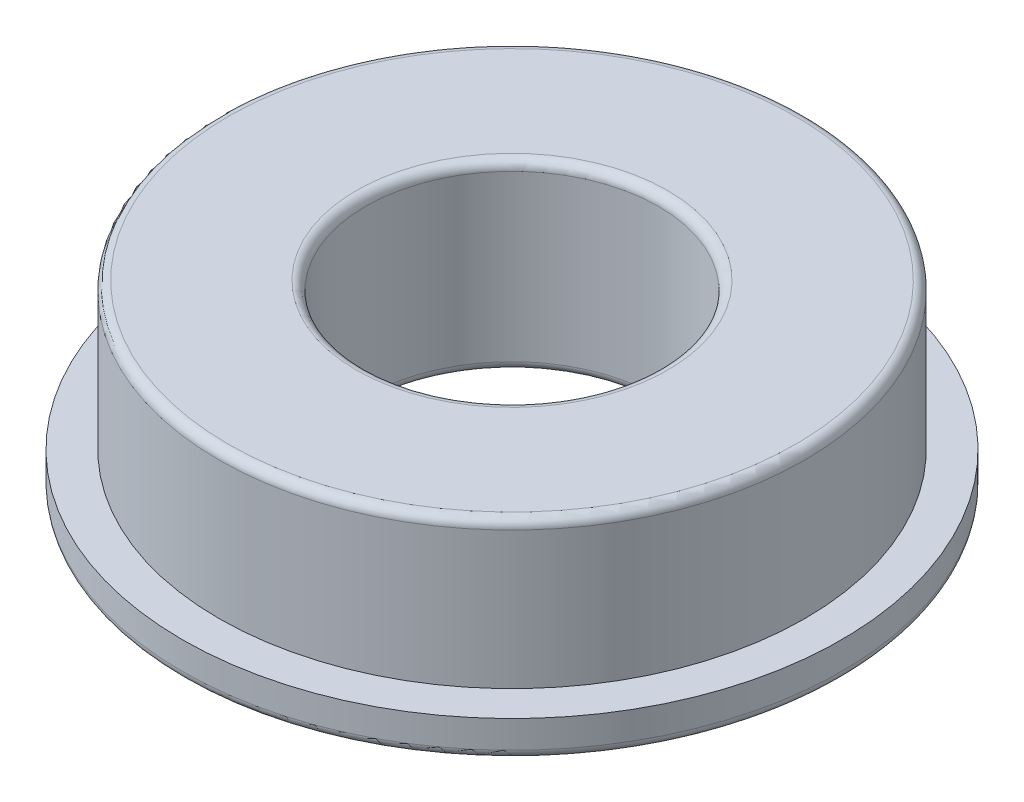
ISO-10303-21;
HEADER;
FILE_DESCRIPTION(('STEP AP214'),'2;1');
FILE_NAME('part.step','',(''),(''),'','','');
FILE_SCHEMA(('AUTOMOTIVE_DESIGN { 1 0 10303 214 1 1 1 1 }'));
ENDSEC;
DATA;
#1=APPLICATION_CONTEXT('core data for automotive mechanical design processes');
#2=APPLICATION_PROTOCOL_DEFINITION('international standard','automotive_design',2000,#1);
#3=PRODUCT_CONTEXT('',#1,'mechanical');
#4=PRODUCT('Part','Part','',(#3));
#5=PRODUCT_RELATED_PRODUCT_CATEGORY('part','',(#4));
#6=PRODUCT_DEFINITION_FORMATION('','',#4);
#7=PRODUCT_DEFINITION_CONTEXT('part definition',#1,'design');
#8=PRODUCT_DEFINITION('design','',#6,#7);
#9=PRODUCT_DEFINITION_SHAPE('','',#8);
#10=(LENGTH_UNIT() NAMED_UNIT(*) SI_UNIT(.MILLI.,.METRE.));
#11=(NAMED_UNIT(*) PLANE_ANGLE_UNIT() SI_UNIT($,.RADIAN.));
#12=(NAMED_UNIT(*) SI_UNIT($,.STERADIAN.) SOLID_ANGLE_UNIT());
#13=UNCERTAINTY_MEASURE_WITH_UNIT(LENGTH_MEASURE(1.E-05),#10,'distance_accuracy_value','');
#14=(GEOMETRIC_REPRESENTATION_CONTEXT(3) GLOBAL_UNCERTAINTY_ASSIGNED_CONTEXT((#13)) GLOBAL_UNIT_ASSIGNED_CONTEXT((#10,
#11,#12)) REPRESENTATION_CONTEXT('',''));
#15=CARTESIAN_POINT('',(0.,0.,0.));
#16=DIRECTION('',(0.,0.,1.));
#17=DIRECTION('',(1.,0.,0.));
#18=AXIS2_PLACEMENT_3D('',#15,#16,#17);
#19=CARTESIAN_POINT('',(8.,5.,0.));
#20=DIRECTION('',(0.,1.,0.));
#21=DIRECTION('',(0.,0.,1.));
#22=AXIS2_PLACEMENT_3D('',#19,#20,#21);
#23=PLANE('',#22);
#24=CARTESIAN_POINT('',(0.,5.,0.));
#25=DIRECTION('',(0.,1.,0.));
#26=DIRECTION('',(0.,0.,1.));
#27=AXIS2_PLACEMENT_3D('',#24,#25,#26);
#28=CIRCLE('',#27,7.75);
#29=CARTESIAN_POINT('',(0.,5.,7.75));
#30=VERTEX_POINT('',#29);
#31=EDGE_CURVE('E10',#30,#30,#28,.T.);
#32=ORIENTED_EDGE('',*,*,#31,.T.);
#33=EDGE_LOOP('',(#32));
#34=FACE_BOUND('',#33,.T.);
#35=CARTESIAN_POINT('',(0.,5.,0.));
#36=DIRECTION('',(0.,1.,0.));
#37=DIRECTION('',(0.,0.,1.));
#38=AXIS2_PLACEMENT_3D('',#35,#36,#37);
#39=CIRCLE('',#38,4.25);
#40=CARTESIAN_POINT('',(0.,5.,4.25));
#41=VERTEX_POINT('',#40);
#42=EDGE_CURVE('E38',#41,#41,#39,.F.);
#43=ORIENTED_EDGE('',*,*,#42,.T.);
#44=EDGE_LOOP('',(#43));
#45=FACE_BOUND('',#44,.T.);
#46=ADVANCED_FACE('F31',(#34,#45),#23,.T.);
#47=CARTESIAN_POINT('',(0.,0.,0.));
#48=DIRECTION('',(0.,-1.,0.));
#49=DIRECTION('',(0.,0.,-1.));
#50=AXIS2_PLACEMENT_3D('',#47,#48,#49);
#51=CYLINDRICAL_SURFACE('',#50,4.);
#52=CARTESIAN_POINT('',(0.,0.25,0.));
#53=DIRECTION('',(0.,-1.,0.));
#54=DIRECTION('',(0.,0.,-1.));
#55=AXIS2_PLACEMENT_3D('',#52,#53,#54);
#56=CIRCLE('',#55,4.);
#57=CARTESIAN_POINT('',(0.,0.25,-4.));
#58=VERTEX_POINT('',#57);
#59=EDGE_CURVE('E57',#58,#58,#56,.T.);
#60=ORIENTED_EDGE('',*,*,#59,.T.);
#61=EDGE_LOOP('',(#60));
#62=FACE_BOUND('',#61,.T.);
#63=CARTESIAN_POINT('',(0.,4.75,0.));
#64=DIRECTION('',(0.,1.,0.));
#65=DIRECTION('',(0.,0.,1.));
#66=AXIS2_PLACEMENT_3D('',#63,#64,#65);
#67=CIRCLE('',#66,4.);
#68=CARTESIAN_POINT('',(0.,4.75,4.));
#69=VERTEX_POINT('',#68);
#70=EDGE_CURVE('E60',#69,#69,#67,.T.);
#71=ORIENTED_EDGE('',*,*,#70,.T.);
#72=EDGE_LOOP('',(#71));
#73=FACE_BOUND('',#72,.T.);
#74=ADVANCED_FACE('F88',(#62,#73),#51,.F.);
#75=CARTESIAN_POINT('',(4.,0.,0.));
#76=DIRECTION('',(0.,-1.,0.));
#77=DIRECTION('',(0.,0.,-1.));
#78=AXIS2_PLACEMENT_3D('',#75,#76,#77);
#79=PLANE('',#78);
#80=CARTESIAN_POINT('',(0.,0.,0.));
#81=DIRECTION('',(0.,-1.,0.));
#82=DIRECTION('',(0.,0.,-1.));
#83=AXIS2_PLACEMENT_3D('',#80,#81,#82);
#84=CIRCLE('',#83,4.25);
#85=CARTESIAN_POINT('',(0.,0.,-4.25));
#86=VERTEX_POINT('',#85);
#87=EDGE_CURVE('E51',#86,#86,#84,.F.);
#88=ORIENTED_EDGE('',*,*,#87,.T.);
#89=EDGE_LOOP('',(#88));
#90=FACE_BOUND('',#89,.T.);
#91=CARTESIAN_POINT('',(0.,0.,0.));
#92=DIRECTION('',(0.,-1.,0.));
#93=DIRECTION('',(0.,0.,-1.));
#94=AXIS2_PLACEMENT_3D('',#91,#92,#93);
#95=CIRCLE('',#94,8.75);
#96=CARTESIAN_POINT('',(0.,0.,-8.75));
#97=VERTEX_POINT('',#96);
#98=EDGE_CURVE('E54',#97,#97,#95,.T.);
#99=ORIENTED_EDGE('',*,*,#98,.T.);
#100=EDGE_LOOP('',(#99));
#101=FACE_BOUND('',#100,.T.);
#102=ADVANCED_FACE('F93',(#90,#101),#79,.T.);
#103=CARTESIAN_POINT('',(0.,0.,0.));
#104=DIRECTION('',(0.,-1.,0.));
#105=DIRECTION('',(0.,0.,-1.));
#106=AXIS2_PLACEMENT_3D('',#103,#104,#105);
#107=CYLINDRICAL_SURFACE('',#106,9.);
#108=CARTESIAN_POINT('',(0.,0.25,0.));
#109=DIRECTION('',(0.,-1.,0.));
#110=DIRECTION('',(0.,0.,-1.));
#111=AXIS2_PLACEMENT_3D('',#108,#109,#110);
#112=CIRCLE('',#111,9.);
#113=CARTESIAN_POINT('',(0.,0.25,-9.));
#114=VERTEX_POINT('',#113);
#115=EDGE_CURVE('E46',#114,#114,#112,.F.);
#116=ORIENTED_EDGE('',*,*,#115,.T.);
#117=EDGE_LOOP('',(#116));
#118=FACE_BOUND('',#117,.T.);
#119=CARTESIAN_POINT('',(0.,1.,0.));
#120=DIRECTION('',(0.,-1.,0.));
#121=DIRECTION('',(0.,0.,-1.));
#122=AXIS2_PLACEMENT_3D('',#119,#120,#121);
#123=CIRCLE('',#122,9.);
#124=CARTESIAN_POINT('',(0.,1.,-9.));
#125=VERTEX_POINT('',#124);
#126=EDGE_CURVE('E63',#125,#125,#123,.T.);
#127=ORIENTED_EDGE('',*,*,#126,.T.);
#128=EDGE_LOOP('',(#127));
#129=FACE_BOUND('',#128,.T.);
#130=ADVANCED_FACE('F85',(#118,#129),#107,.T.);
#131=CARTESIAN_POINT('',(9.,1.,0.));
#132=DIRECTION('',(0.,1.,0.));
#133=DIRECTION('',(0.,0.,1.));
#134=AXIS2_PLACEMENT_3D('',#131,#132,#133);
#135=PLANE('',#134);
#136=CARTESIAN_POINT('',(0.,1.,0.));
#137=DIRECTION('',(0.,-1.,0.));
#138=DIRECTION('',(0.,0.,-1.));
#139=AXIS2_PLACEMENT_3D('',#136,#137,#138);
#140=CIRCLE('',#139,8.);
#141=CARTESIAN_POINT('',(0.,1.,-8.));
#142=VERTEX_POINT('',#141);
#143=EDGE_CURVE('E66',#142,#142,#140,.T.);
#144=ORIENTED_EDGE('',*,*,#143,.T.);
#145=EDGE_LOOP('',(#144));
#146=FACE_BOUND('',#145,.T.);
#147=ORIENTED_EDGE('',*,*,#126,.F.);
#148=EDGE_LOOP('',(#147));
#149=FACE_BOUND('',#148,.T.);
#150=ADVANCED_FACE('F70',(#146,#149),#135,.T.);
#151=CARTESIAN_POINT('',(0.,0.,0.));
#152=DIRECTION('',(0.,-1.,0.));
#153=DIRECTION('',(0.,0.,-1.));
#154=AXIS2_PLACEMENT_3D('',#151,#152,#153);
#155=CYLINDRICAL_SURFACE('',#154,8.);
#156=CARTESIAN_POINT('',(0.,4.75,0.));
#157=DIRECTION('',(0.,1.,0.));
#158=DIRECTION('',(0.,0.,1.));
#159=AXIS2_PLACEMENT_3D('',#156,#157,#158);
#160=CIRCLE('',#159,8.);
#161=CARTESIAN_POINT('',(0.,4.75,8.));
#162=VERTEX_POINT('',#161);
#163=EDGE_CURVE('E42',#162,#162,#160,.F.);
#164=ORIENTED_EDGE('',*,*,#163,.T.);
#165=EDGE_LOOP('',(#164));
#166=FACE_BOUND('',#165,.T.);
#167=ORIENTED_EDGE('',*,*,#143,.F.);
#168=EDGE_LOOP('',(#167));
#169=FACE_BOUND('',#168,.T.);
#170=ADVANCED_FACE('F73',(#166,#169),#155,.T.);
#171=CARTESIAN_POINT('',(0.,0.25,0.));
#172=DIRECTION('',(0.,-1.,0.));
#173=DIRECTION('',(0.,0.,-1.));
#174=AXIS2_PLACEMENT_3D('',#171,#172,#173);
#175=TOROIDAL_SURFACE('',#174,4.25,0.25);
#176=ORIENTED_EDGE('',*,*,#87,.F.);
#177=EDGE_LOOP('',(#176));
#178=FACE_BOUND('',#177,.T.);
#179=ORIENTED_EDGE('',*,*,#59,.F.);
#180=EDGE_LOOP('',(#179));
#181=FACE_BOUND('',#180,.T.);
#182=ADVANCED_FACE('F75',(#178,#181),#175,.T.);
#183=CARTESIAN_POINT('',(0.,0.25,0.));
#184=DIRECTION('',(0.,-1.,0.));
#185=DIRECTION('',(0.,0.,-1.));
#186=AXIS2_PLACEMENT_3D('',#183,#184,#185);
#187=TOROIDAL_SURFACE('',#186,8.75,0.25);
#188=ORIENTED_EDGE('',*,*,#115,.F.);
#189=EDGE_LOOP('',(#188));
#190=FACE_BOUND('',#189,.T.);
#191=ORIENTED_EDGE('',*,*,#98,.F.);
#192=EDGE_LOOP('',(#191));
#193=FACE_BOUND('',#192,.T.);
#194=ADVANCED_FACE('F82',(#190,#193),#187,.T.);
#195=CARTESIAN_POINT('',(0.,4.75,0.));
#196=DIRECTION('',(0.,1.,0.));
#197=DIRECTION('',(0.,0.,1.));
#198=AXIS2_PLACEMENT_3D('',#195,#196,#197);
#199=TOROIDAL_SURFACE('',#198,7.75,0.25);
#200=ORIENTED_EDGE('',*,*,#31,.F.);
#201=EDGE_LOOP('',(#200));
#202=FACE_BOUND('',#201,.T.);
#203=ORIENTED_EDGE('',*,*,#163,.F.);
#204=EDGE_LOOP('',(#203));
#205=FACE_BOUND('',#204,.T.);
#206=ADVANCED_FACE('F99',(#202,#205),#199,.T.);
#207=CARTESIAN_POINT('',(0.,4.75,0.));
#208=DIRECTION('',(0.,1.,0.));
#209=DIRECTION('',(0.,0.,1.));
#210=AXIS2_PLACEMENT_3D('',#207,#208,#209);
#211=TOROIDAL_SURFACE('',#210,4.25,0.25);
#212=ORIENTED_EDGE('',*,*,#70,.F.);
#213=EDGE_LOOP('',(#212));
#214=FACE_BOUND('',#213,.T.);
#215=ORIENTED_EDGE('',*,*,#42,.F.);
#216=EDGE_LOOP('',(#215));
#217=FACE_BOUND('',#216,.T.);
#218=ADVANCED_FACE('F33',(#214,#217),#211,.T.);
#219=CLOSED_SHELL('',(#46,#74,#102,#130,#150,#170,#182,#194,#206,#218));
#220=MANIFOLD_SOLID_BREP('B2',#219);
#221=ADVANCED_BREP_SHAPE_REPRESENTATION('',(#18,#220),#14);
#222=SHAPE_DEFINITION_REPRESENTATION(#9,#221);
ENDSEC;
END-ISO-10303-21;
